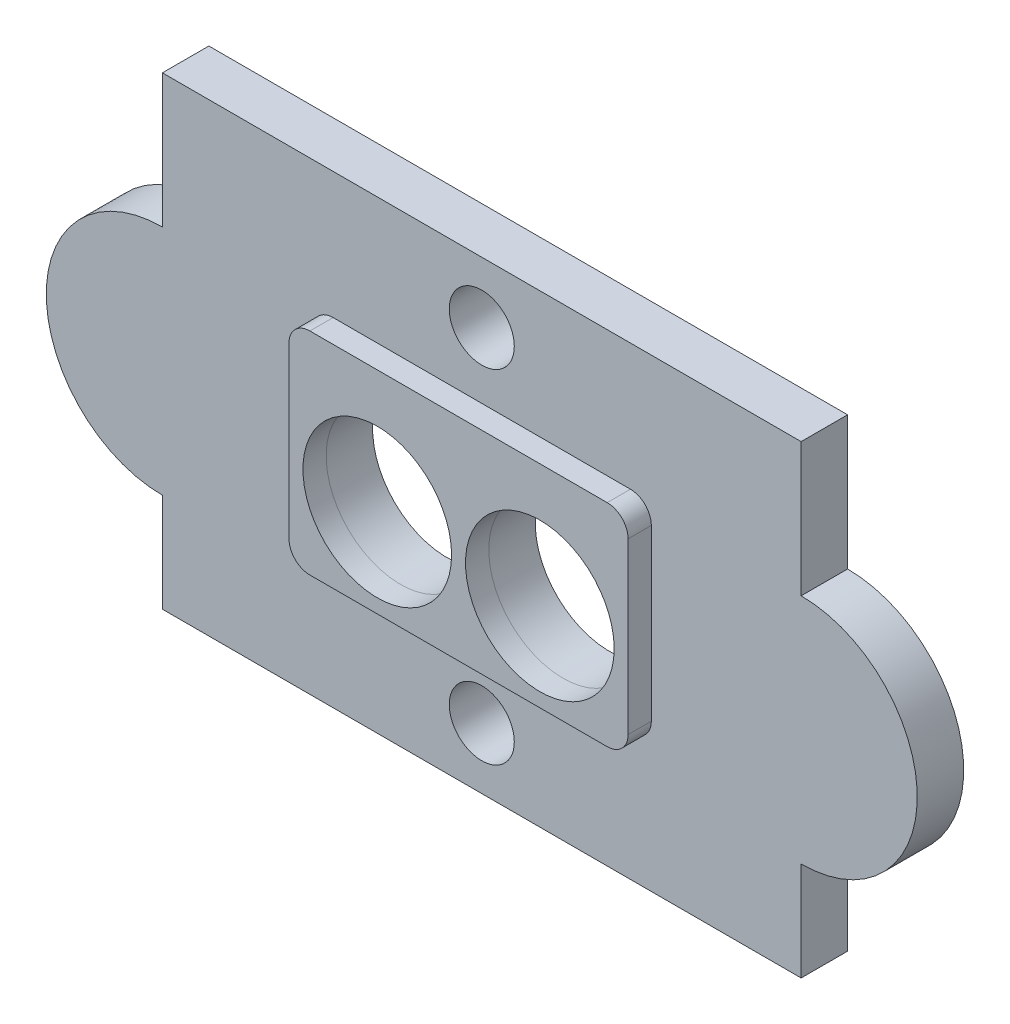
ISO-10303-21;
HEADER;
FILE_DESCRIPTION(('STEP AP214'),'2;1');
FILE_NAME('part.step','',(''),(''),'','','');
FILE_SCHEMA(('AUTOMOTIVE_DESIGN { 1 0 10303 214 1 1 1 1 }'));
ENDSEC;
DATA;
#1=APPLICATION_CONTEXT('core data for automotive mechanical design processes');
#2=APPLICATION_PROTOCOL_DEFINITION('international standard','automotive_design',2000,#1);
#3=PRODUCT_CONTEXT('',#1,'mechanical');
#4=PRODUCT('Part','Part','',(#3));
#5=PRODUCT_RELATED_PRODUCT_CATEGORY('part','',(#4));
#6=PRODUCT_DEFINITION_FORMATION('','',#4);
#7=PRODUCT_DEFINITION_CONTEXT('part definition',#1,'design');
#8=PRODUCT_DEFINITION('design','',#6,#7);
#9=PRODUCT_DEFINITION_SHAPE('','',#8);
#10=(LENGTH_UNIT() NAMED_UNIT(*) SI_UNIT(.MILLI.,.METRE.));
#11=(NAMED_UNIT(*) PLANE_ANGLE_UNIT() SI_UNIT($,.RADIAN.));
#12=(NAMED_UNIT(*) SI_UNIT($,.STERADIAN.) SOLID_ANGLE_UNIT());
#13=UNCERTAINTY_MEASURE_WITH_UNIT(LENGTH_MEASURE(1.E-05),#10,'distance_accuracy_value','');
#14=(GEOMETRIC_REPRESENTATION_CONTEXT(3) GLOBAL_UNCERTAINTY_ASSIGNED_CONTEXT((#13)) GLOBAL_UNIT_ASSIGNED_CONTEXT((#10,
#11,#12)) REPRESENTATION_CONTEXT('',''));
#15=CARTESIAN_POINT('',(0.,0.,0.));
#16=DIRECTION('',(0.,0.,1.));
#17=DIRECTION('',(1.,0.,0.));
#18=AXIS2_PLACEMENT_3D('',#15,#16,#17);
#19=CARTESIAN_POINT('',(0.,0.,-2.));
#20=DIRECTION('',(0.,0.,1.));
#21=DIRECTION('',(1.,0.,0.));
#22=AXIS2_PLACEMENT_3D('',#19,#20,#21);
#23=PLANE('',#22);
#24=DIRECTION('',(-1.,0.,0.));
#25=VECTOR('',#24,1.);
#26=CARTESIAN_POINT('',(0.,10.,-2.));
#27=LINE('',#26,#25);
#28=CARTESIAN_POINT('',(13.75,10.,-2.));
#29=VERTEX_POINT('',#28);
#30=CARTESIAN_POINT('',(-13.75,10.,-2.));
#31=VERTEX_POINT('',#30);
#32=EDGE_CURVE('E183',#29,#31,#27,.T.);
#33=ORIENTED_EDGE('',*,*,#32,.F.);
#34=DIRECTION('',(0.,1.,0.));
#35=VECTOR('',#34,1.);
#36=CARTESIAN_POINT('',(13.75,0.,-2.));
#37=LINE('',#36,#35);
#38=CARTESIAN_POINT('',(13.75,4.25,-2.));
#39=VERTEX_POINT('',#38);
#40=EDGE_CURVE('E128',#39,#29,#37,.T.);
#41=ORIENTED_EDGE('',*,*,#40,.F.);
#42=CARTESIAN_POINT('',(13.75,-0.749999999999997,-2.));
#43=DIRECTION('',(0.,0.,1.));
#44=DIRECTION('',(1.,0.,0.));
#45=AXIS2_PLACEMENT_3D('',#42,#43,#44);
#46=CIRCLE('',#45,5.);
#47=CARTESIAN_POINT('',(13.75,-5.75,-2.));
#48=VERTEX_POINT('',#47);
#49=EDGE_CURVE('E121',#39,#48,#46,.F.);
#50=ORIENTED_EDGE('',*,*,#49,.T.);
#51=DIRECTION('',(0.,1.,0.));
#52=VECTOR('',#51,1.);
#53=CARTESIAN_POINT('',(13.75,0.,-2.));
#54=LINE('',#53,#52);
#55=CARTESIAN_POINT('',(13.75,-10.,-2.));
#56=VERTEX_POINT('',#55);
#57=EDGE_CURVE('E126',#56,#48,#54,.T.);
#58=ORIENTED_EDGE('',*,*,#57,.F.);
#59=DIRECTION('',(1.,0.,0.));
#60=VECTOR('',#59,1.);
#61=CARTESIAN_POINT('',(0.,-10.,-2.));
#62=LINE('',#61,#60);
#63=CARTESIAN_POINT('',(-13.75,-10.,-2.));
#64=VERTEX_POINT('',#63);
#65=EDGE_CURVE('E139',#64,#56,#62,.T.);
#66=ORIENTED_EDGE('',*,*,#65,.F.);
#67=DIRECTION('',(0.,-1.,0.));
#68=VECTOR('',#67,1.);
#69=CARTESIAN_POINT('',(-13.75,0.,-2.));
#70=LINE('',#69,#68);
#71=CARTESIAN_POINT('',(-13.75,-5.75,-2.));
#72=VERTEX_POINT('',#71);
#73=EDGE_CURVE('E141',#72,#64,#70,.T.);
#74=ORIENTED_EDGE('',*,*,#73,.F.);
#75=CARTESIAN_POINT('',(-13.75,-0.749999999999997,-2.));
#76=DIRECTION('',(0.,0.,1.));
#77=DIRECTION('',(1.,0.,0.));
#78=AXIS2_PLACEMENT_3D('',#75,#76,#77);
#79=CIRCLE('',#78,5.);
#80=CARTESIAN_POINT('',(-13.75,4.25,-2.));
#81=VERTEX_POINT('',#80);
#82=EDGE_CURVE('E237',#81,#72,#79,.T.);
#83=ORIENTED_EDGE('',*,*,#82,.F.);
#84=DIRECTION('',(0.,-1.,0.));
#85=VECTOR('',#84,1.);
#86=CARTESIAN_POINT('',(-13.75,0.,-2.));
#87=LINE('',#86,#85);
#88=EDGE_CURVE('E235',#31,#81,#87,.T.);
#89=ORIENTED_EDGE('',*,*,#88,.F.);
#90=EDGE_LOOP('',(#33,#41,#50,#58,#66,#74,#83,#89));
#91=FACE_BOUND('',#90,.T.);
#92=CARTESIAN_POINT('',(3.5,-0.749999999999997,-2.));
#93=DIRECTION('',(0.,0.,1.));
#94=DIRECTION('',(1.,0.,0.));
#95=AXIS2_PLACEMENT_3D('',#92,#93,#94);
#96=CIRCLE('',#95,3.2);
#97=CARTESIAN_POINT('',(6.7,-0.749999999999997,-2.));
#98=VERTEX_POINT('',#97);
#99=EDGE_CURVE('E231',#98,#98,#96,.T.);
#100=ORIENTED_EDGE('',*,*,#99,.T.);
#101=EDGE_LOOP('',(#100));
#102=FACE_BOUND('',#101,.T.);
#103=CARTESIAN_POINT('',(-3.5,-0.749999999999997,-2.));
#104=DIRECTION('',(0.,0.,1.));
#105=DIRECTION('',(1.,0.,0.));
#106=AXIS2_PLACEMENT_3D('',#103,#104,#105);
#107=CIRCLE('',#106,3.2);
#108=CARTESIAN_POINT('',(-0.300000000000003,-0.749999999999997,-2.));
#109=VERTEX_POINT('',#108);
#110=EDGE_CURVE('E173',#109,#109,#107,.T.);
#111=ORIENTED_EDGE('',*,*,#110,.T.);
#112=EDGE_LOOP('',(#111));
#113=FACE_BOUND('',#112,.T.);
#114=CARTESIAN_POINT('',(0.,-7.375,-2.));
#115=DIRECTION('',(0.,0.,1.));
#116=DIRECTION('',(1.,0.,0.));
#117=AXIS2_PLACEMENT_3D('',#114,#115,#116);
#118=CIRCLE('',#117,1.4);
#119=CARTESIAN_POINT('',(1.4,-7.375,-2.));
#120=VERTEX_POINT('',#119);
#121=EDGE_CURVE('E220',#120,#120,#118,.F.);
#122=ORIENTED_EDGE('',*,*,#121,.F.);
#123=EDGE_LOOP('',(#122));
#124=FACE_BOUND('',#123,.T.);
#125=CARTESIAN_POINT('',(0.,7.375,-2.));
#126=DIRECTION('',(0.,0.,1.));
#127=DIRECTION('',(1.,0.,0.));
#128=AXIS2_PLACEMENT_3D('',#125,#126,#127);
#129=CIRCLE('',#128,1.4);
#130=CARTESIAN_POINT('',(1.4,7.375,-2.));
#131=VERTEX_POINT('',#130);
#132=EDGE_CURVE('E150',#131,#131,#129,.T.);
#133=ORIENTED_EDGE('',*,*,#132,.T.);
#134=EDGE_LOOP('',(#133));
#135=FACE_BOUND('',#134,.T.);
#136=ADVANCED_FACE('F48',(#91,#102,#113,#124,#135),#23,.F.);
#137=CARTESIAN_POINT('',(0.,0.,0.));
#138=DIRECTION('',(0.,0.,1.));
#139=DIRECTION('',(1.,0.,0.));
#140=AXIS2_PLACEMENT_3D('',#137,#138,#139);
#141=PLANE('',#140);
#142=CARTESIAN_POINT('',(0.,-7.375,0.));
#143=DIRECTION('',(0.,0.,1.));
#144=DIRECTION('',(1.,0.,0.));
#145=AXIS2_PLACEMENT_3D('',#142,#143,#144);
#146=CIRCLE('',#145,1.4);
#147=CARTESIAN_POINT('',(1.4,-7.375,0.));
#148=VERTEX_POINT('',#147);
#149=EDGE_CURVE('E224',#148,#148,#146,.F.);
#150=ORIENTED_EDGE('',*,*,#149,.T.);
#151=EDGE_LOOP('',(#150));
#152=FACE_BOUND('',#151,.T.);
#153=CARTESIAN_POINT('',(-3.5,-0.749999999999997,0.));
#154=DIRECTION('',(0.,0.,1.));
#155=DIRECTION('',(1.,0.,0.));
#156=AXIS2_PLACEMENT_3D('',#153,#154,#155);
#157=CIRCLE('',#156,3.2);
#158=CARTESIAN_POINT('',(-0.300000000000003,-0.749999999999997,0.));
#159=VERTEX_POINT('',#158);
#160=EDGE_CURVE('E146',#159,#159,#157,.T.);
#161=ORIENTED_EDGE('',*,*,#160,.F.);
#162=EDGE_LOOP('',(#161));
#163=FACE_BOUND('',#162,.T.);
#164=CARTESIAN_POINT('',(3.5,-0.749999999999997,0.));
#165=DIRECTION('',(0.,0.,1.));
#166=DIRECTION('',(1.,0.,0.));
#167=AXIS2_PLACEMENT_3D('',#164,#165,#166);
#168=CIRCLE('',#167,3.2);
#169=CARTESIAN_POINT('',(6.7,-0.749999999999997,0.));
#170=VERTEX_POINT('',#169);
#171=EDGE_CURVE('E149',#170,#170,#168,.T.);
#172=ORIENTED_EDGE('',*,*,#171,.F.);
#173=EDGE_LOOP('',(#172));
#174=FACE_BOUND('',#173,.T.);
#175=DIRECTION('',(-1.,0.,0.));
#176=VECTOR('',#175,1.);
#177=CARTESIAN_POINT('',(0.,10.,0.));
#178=LINE('',#177,#176);
#179=CARTESIAN_POINT('',(13.75,10.,0.));
#180=VERTEX_POINT('',#179);
#181=CARTESIAN_POINT('',(-13.75,10.,0.));
#182=VERTEX_POINT('',#181);
#183=EDGE_CURVE('E153',#180,#182,#178,.T.);
#184=ORIENTED_EDGE('',*,*,#183,.T.);
#185=DIRECTION('',(0.,-1.,0.));
#186=VECTOR('',#185,1.);
#187=CARTESIAN_POINT('',(-13.75,0.,0.));
#188=LINE('',#187,#186);
#189=CARTESIAN_POINT('',(-13.75,4.25,0.));
#190=VERTEX_POINT('',#189);
#191=EDGE_CURVE('E156',#182,#190,#188,.T.);
#192=ORIENTED_EDGE('',*,*,#191,.T.);
#193=CARTESIAN_POINT('',(-13.75,-0.749999999999997,0.));
#194=DIRECTION('',(0.,0.,1.));
#195=DIRECTION('',(1.,0.,0.));
#196=AXIS2_PLACEMENT_3D('',#193,#194,#195);
#197=CIRCLE('',#196,5.);
#198=CARTESIAN_POINT('',(-13.75,-5.75,0.));
#199=VERTEX_POINT('',#198);
#200=EDGE_CURVE('E159',#190,#199,#197,.T.);
#201=ORIENTED_EDGE('',*,*,#200,.T.);
#202=DIRECTION('',(0.,-1.,0.));
#203=VECTOR('',#202,1.);
#204=CARTESIAN_POINT('',(-13.75,0.,0.));
#205=LINE('',#204,#203);
#206=CARTESIAN_POINT('',(-13.75,-10.,0.));
#207=VERTEX_POINT('',#206);
#208=EDGE_CURVE('E162',#199,#207,#205,.T.);
#209=ORIENTED_EDGE('',*,*,#208,.T.);
#210=DIRECTION('',(1.,0.,0.));
#211=VECTOR('',#210,1.);
#212=CARTESIAN_POINT('',(0.,-10.,0.));
#213=LINE('',#212,#211);
#214=CARTESIAN_POINT('',(13.75,-10.,0.));
#215=VERTEX_POINT('',#214);
#216=EDGE_CURVE('E165',#207,#215,#213,.T.);
#217=ORIENTED_EDGE('',*,*,#216,.T.);
#218=DIRECTION('',(0.,1.,0.));
#219=VECTOR('',#218,1.);
#220=CARTESIAN_POINT('',(13.75,0.,0.));
#221=LINE('',#220,#219);
#222=CARTESIAN_POINT('',(13.75,-5.75,0.));
#223=VERTEX_POINT('',#222);
#224=EDGE_CURVE('E168',#215,#223,#221,.T.);
#225=ORIENTED_EDGE('',*,*,#224,.T.);
#226=CARTESIAN_POINT('',(13.75,-0.749999999999997,0.));
#227=DIRECTION('',(0.,0.,1.));
#228=DIRECTION('',(1.,0.,0.));
#229=AXIS2_PLACEMENT_3D('',#226,#227,#228);
#230=CIRCLE('',#229,5.);
#231=CARTESIAN_POINT('',(13.75,4.25,0.));
#232=VERTEX_POINT('',#231);
#233=EDGE_CURVE('E132',#232,#223,#230,.F.);
#234=ORIENTED_EDGE('',*,*,#233,.F.);
#235=DIRECTION('',(0.,1.,0.));
#236=VECTOR('',#235,1.);
#237=CARTESIAN_POINT('',(13.75,0.,0.));
#238=LINE('',#237,#236);
#239=EDGE_CURVE('E171',#232,#180,#238,.T.);
#240=ORIENTED_EDGE('',*,*,#239,.T.);
#241=EDGE_LOOP('',(#184,#192,#201,#209,#217,#225,#234,#240));
#242=FACE_BOUND('',#241,.T.);
#243=CARTESIAN_POINT('',(0.,7.375,0.));
#244=DIRECTION('',(0.,0.,1.));
#245=DIRECTION('',(1.,0.,0.));
#246=AXIS2_PLACEMENT_3D('',#243,#244,#245);
#247=CIRCLE('',#246,1.4);
#248=CARTESIAN_POINT('',(1.4,7.375,0.));
#249=VERTEX_POINT('',#248);
#250=EDGE_CURVE('E219',#249,#249,#247,.T.);
#251=ORIENTED_EDGE('',*,*,#250,.F.);
#252=EDGE_LOOP('',(#251));
#253=FACE_BOUND('',#252,.T.);
#254=ADVANCED_FACE('F186',(#152,#163,#174,#242,#253),#141,.T.);
#255=CARTESIAN_POINT('',(0.,10.,-2.));
#256=DIRECTION('',(0.,1.,0.));
#257=DIRECTION('',(0.,0.,1.));
#258=AXIS2_PLACEMENT_3D('',#255,#256,#257);
#259=PLANE('',#258);
#260=ORIENTED_EDGE('',*,*,#183,.F.);
#261=DIRECTION('',(0.,0.,1.));
#262=VECTOR('',#261,1.);
#263=CARTESIAN_POINT('',(13.75,10.,-2.));
#264=LINE('',#263,#262);
#265=EDGE_CURVE('E12',#29,#180,#264,.T.);
#266=ORIENTED_EDGE('',*,*,#265,.F.);
#267=ORIENTED_EDGE('',*,*,#32,.T.);
#268=DIRECTION('',(0.,0.,1.));
#269=VECTOR('',#268,1.);
#270=CARTESIAN_POINT('',(-13.75,10.,-2.));
#271=LINE('',#270,#269);
#272=EDGE_CURVE('E52',#31,#182,#271,.T.);
#273=ORIENTED_EDGE('',*,*,#272,.T.);
#274=EDGE_LOOP('',(#260,#266,#267,#273));
#275=FACE_BOUND('',#274,.T.);
#276=ADVANCED_FACE('F182',(#275),#259,.T.);
#277=CARTESIAN_POINT('',(13.75,0.,-2.));
#278=DIRECTION('',(1.,0.,0.));
#279=DIRECTION('',(0.,1.,0.));
#280=AXIS2_PLACEMENT_3D('',#277,#278,#279);
#281=PLANE('',#280);
#282=ORIENTED_EDGE('',*,*,#239,.F.);
#283=DIRECTION('',(0.,0.,1.));
#284=VECTOR('',#283,1.);
#285=CARTESIAN_POINT('',(13.75,4.25,-2.));
#286=LINE('',#285,#284);
#287=EDGE_CURVE('E58',#39,#232,#286,.T.);
#288=ORIENTED_EDGE('',*,*,#287,.F.);
#289=ORIENTED_EDGE('',*,*,#40,.T.);
#290=ORIENTED_EDGE('',*,*,#265,.T.);
#291=EDGE_LOOP('',(#282,#288,#289,#290));
#292=FACE_BOUND('',#291,.T.);
#293=ADVANCED_FACE('F188',(#292),#281,.T.);
#294=CARTESIAN_POINT('',(13.75,-0.749999999999997,-2.));
#295=DIRECTION('',(0.,0.,1.));
#296=DIRECTION('',(1.,0.,0.));
#297=AXIS2_PLACEMENT_3D('',#294,#295,#296);
#298=CYLINDRICAL_SURFACE('',#297,5.);
#299=ORIENTED_EDGE('',*,*,#233,.T.);
#300=DIRECTION('',(0.,0.,1.));
#301=VECTOR('',#300,1.);
#302=CARTESIAN_POINT('',(13.75,-5.75,-2.));
#303=LINE('',#302,#301);
#304=EDGE_CURVE('E130',#48,#223,#303,.T.);
#305=ORIENTED_EDGE('',*,*,#304,.F.);
#306=ORIENTED_EDGE('',*,*,#49,.F.);
#307=ORIENTED_EDGE('',*,*,#287,.T.);
#308=EDGE_LOOP('',(#299,#305,#306,#307));
#309=FACE_BOUND('',#308,.T.);
#310=ADVANCED_FACE('F131',(#309),#298,.T.);
#311=CARTESIAN_POINT('',(13.75,0.,-2.));
#312=DIRECTION('',(1.,0.,0.));
#313=DIRECTION('',(0.,1.,0.));
#314=AXIS2_PLACEMENT_3D('',#311,#312,#313);
#315=PLANE('',#314);
#316=ORIENTED_EDGE('',*,*,#224,.F.);
#317=DIRECTION('',(0.,0.,1.));
#318=VECTOR('',#317,1.);
#319=CARTESIAN_POINT('',(13.75,-10.,-2.));
#320=LINE('',#319,#318);
#321=EDGE_CURVE('E136',#56,#215,#320,.T.);
#322=ORIENTED_EDGE('',*,*,#321,.F.);
#323=ORIENTED_EDGE('',*,*,#57,.T.);
#324=ORIENTED_EDGE('',*,*,#304,.T.);
#325=EDGE_LOOP('',(#316,#322,#323,#324));
#326=FACE_BOUND('',#325,.T.);
#327=ADVANCED_FACE('F138',(#326),#315,.T.);
#328=CARTESIAN_POINT('',(0.,-10.,-2.));
#329=DIRECTION('',(0.,-1.,0.));
#330=DIRECTION('',(0.,0.,-1.));
#331=AXIS2_PLACEMENT_3D('',#328,#329,#330);
#332=PLANE('',#331);
#333=ORIENTED_EDGE('',*,*,#216,.F.);
#334=DIRECTION('',(0.,0.,1.));
#335=VECTOR('',#334,1.);
#336=CARTESIAN_POINT('',(-13.75,-10.,-2.));
#337=LINE('',#336,#335);
#338=EDGE_CURVE('E177',#64,#207,#337,.T.);
#339=ORIENTED_EDGE('',*,*,#338,.F.);
#340=ORIENTED_EDGE('',*,*,#65,.T.);
#341=ORIENTED_EDGE('',*,*,#321,.T.);
#342=EDGE_LOOP('',(#333,#339,#340,#341));
#343=FACE_BOUND('',#342,.T.);
#344=ADVANCED_FACE('F249',(#343),#332,.T.);
#345=CARTESIAN_POINT('',(-13.75,0.,-2.));
#346=DIRECTION('',(-1.,0.,0.));
#347=DIRECTION('',(0.,-1.,0.));
#348=AXIS2_PLACEMENT_3D('',#345,#346,#347);
#349=PLANE('',#348);
#350=ORIENTED_EDGE('',*,*,#208,.F.);
#351=DIRECTION('',(0.,0.,1.));
#352=VECTOR('',#351,1.);
#353=CARTESIAN_POINT('',(-13.75,-5.75,-2.));
#354=LINE('',#353,#352);
#355=EDGE_CURVE('E179',#72,#199,#354,.T.);
#356=ORIENTED_EDGE('',*,*,#355,.F.);
#357=ORIENTED_EDGE('',*,*,#73,.T.);
#358=ORIENTED_EDGE('',*,*,#338,.T.);
#359=EDGE_LOOP('',(#350,#356,#357,#358));
#360=FACE_BOUND('',#359,.T.);
#361=ADVANCED_FACE('F243',(#360),#349,.T.);
#362=CARTESIAN_POINT('',(-13.75,-0.749999999999997,-2.));
#363=DIRECTION('',(0.,0.,1.));
#364=DIRECTION('',(1.,0.,0.));
#365=AXIS2_PLACEMENT_3D('',#362,#363,#364);
#366=CYLINDRICAL_SURFACE('',#365,5.);
#367=ORIENTED_EDGE('',*,*,#200,.F.);
#368=DIRECTION('',(0.,0.,1.));
#369=VECTOR('',#368,1.);
#370=CARTESIAN_POINT('',(-13.75,4.25,-2.));
#371=LINE('',#370,#369);
#372=EDGE_CURVE('E180',#81,#190,#371,.T.);
#373=ORIENTED_EDGE('',*,*,#372,.F.);
#374=ORIENTED_EDGE('',*,*,#82,.T.);
#375=ORIENTED_EDGE('',*,*,#355,.T.);
#376=EDGE_LOOP('',(#367,#373,#374,#375));
#377=FACE_BOUND('',#376,.T.);
#378=ADVANCED_FACE('F247',(#377),#366,.T.);
#379=CARTESIAN_POINT('',(3.5,-0.749999999999997,-2.));
#380=DIRECTION('',(0.,0.,1.));
#381=DIRECTION('',(1.,0.,0.));
#382=AXIS2_PLACEMENT_3D('',#379,#380,#381);
#383=CYLINDRICAL_SURFACE('',#382,3.2);
#384=ORIENTED_EDGE('',*,*,#99,.F.);
#385=EDGE_LOOP('',(#384));
#386=FACE_BOUND('',#385,.T.);
#387=ORIENTED_EDGE('',*,*,#171,.T.);
#388=EDGE_LOOP('',(#387));
#389=FACE_BOUND('',#388,.T.);
#390=ADVANCED_FACE('F261',(#386,#389),#383,.F.);
#391=CARTESIAN_POINT('',(-3.5,-0.749999999999997,-2.));
#392=DIRECTION('',(0.,0.,1.));
#393=DIRECTION('',(1.,0.,0.));
#394=AXIS2_PLACEMENT_3D('',#391,#392,#393);
#395=CYLINDRICAL_SURFACE('',#394,3.2);
#396=ORIENTED_EDGE('',*,*,#110,.F.);
#397=EDGE_LOOP('',(#396));
#398=FACE_BOUND('',#397,.T.);
#399=ORIENTED_EDGE('',*,*,#160,.T.);
#400=EDGE_LOOP('',(#399));
#401=FACE_BOUND('',#400,.T.);
#402=ADVANCED_FACE('F50',(#398,#401),#395,.F.);
#403=CARTESIAN_POINT('',(-13.75,0.,-2.));
#404=DIRECTION('',(-1.,0.,0.));
#405=DIRECTION('',(0.,-1.,0.));
#406=AXIS2_PLACEMENT_3D('',#403,#404,#405);
#407=PLANE('',#406);
#408=ORIENTED_EDGE('',*,*,#191,.F.);
#409=ORIENTED_EDGE('',*,*,#272,.F.);
#410=ORIENTED_EDGE('',*,*,#88,.T.);
#411=ORIENTED_EDGE('',*,*,#372,.T.);
#412=EDGE_LOOP('',(#408,#409,#410,#411));
#413=FACE_BOUND('',#412,.T.);
#414=ADVANCED_FACE('F184',(#413),#407,.T.);
#415=CARTESIAN_POINT('',(0.,-7.375,-2.));
#416=DIRECTION('',(0.,0.,1.));
#417=DIRECTION('',(1.,0.,0.));
#418=AXIS2_PLACEMENT_3D('',#415,#416,#417);
#419=CYLINDRICAL_SURFACE('',#418,1.4);
#420=ORIENTED_EDGE('',*,*,#121,.T.);
#421=EDGE_LOOP('',(#420));
#422=FACE_BOUND('',#421,.T.);
#423=ORIENTED_EDGE('',*,*,#149,.F.);
#424=EDGE_LOOP('',(#423));
#425=FACE_BOUND('',#424,.T.);
#426=ADVANCED_FACE('F205',(#422,#425),#419,.F.);
#427=CARTESIAN_POINT('',(0.,7.375,-2.));
#428=DIRECTION('',(0.,0.,1.));
#429=DIRECTION('',(1.,0.,0.));
#430=AXIS2_PLACEMENT_3D('',#427,#428,#429);
#431=CYLINDRICAL_SURFACE('',#430,1.4);
#432=ORIENTED_EDGE('',*,*,#132,.F.);
#433=EDGE_LOOP('',(#432));
#434=FACE_BOUND('',#433,.T.);
#435=ORIENTED_EDGE('',*,*,#250,.T.);
#436=EDGE_LOOP('',(#435));
#437=FACE_BOUND('',#436,.T.);
#438=ADVANCED_FACE('F208',(#434,#437),#431,.F.);
#439=CLOSED_SHELL('',(#136,#254,#276,#293,#310,#327,#344,#361,#378,#390,#402,#414,#426,#438));
#440=MANIFOLD_SOLID_BREP('B2',#439);
#441=CARTESIAN_POINT('',(0.,-4.55,1.));
#442=DIRECTION('',(0.,1.,0.));
#443=DIRECTION('',(0.,0.,1.));
#444=AXIS2_PLACEMENT_3D('',#441,#442,#443);
#445=PLANE('',#444);
#446=DIRECTION('',(1.,0.,0.));
#447=VECTOR('',#446,1.);
#448=CARTESIAN_POINT('',(0.,-4.55,1.));
#449=LINE('',#448,#447);
#450=CARTESIAN_POINT('',(-6.40000000000001,-4.55,1.));
#451=VERTEX_POINT('',#450);
#452=CARTESIAN_POINT('',(6.39999999999999,-4.55,1.));
#453=VERTEX_POINT('',#452);
#454=EDGE_CURVE('E548',#451,#453,#449,.T.);
#455=ORIENTED_EDGE('',*,*,#454,.F.);
#456=DIRECTION('',(0.,0.,-1.));
#457=VECTOR('',#456,1.);
#458=CARTESIAN_POINT('',(-6.40000000000001,-4.55,0.));
#459=LINE('',#458,#457);
#460=CARTESIAN_POINT('',(-6.40000000000001,-4.55,0.));
#461=VERTEX_POINT('',#460);
#462=EDGE_CURVE('E46',#451,#461,#459,.T.);
#463=ORIENTED_EDGE('',*,*,#462,.T.);
#464=DIRECTION('',(1.,0.,0.));
#465=VECTOR('',#464,1.);
#466=CARTESIAN_POINT('',(0.,-4.55,0.));
#467=LINE('',#466,#465);
#468=CARTESIAN_POINT('',(6.39999999999999,-4.55,0.));
#469=VERTEX_POINT('',#468);
#470=EDGE_CURVE('E498',#461,#469,#467,.T.);
#471=ORIENTED_EDGE('',*,*,#470,.T.);
#472=DIRECTION('',(0.,0.,-1.));
#473=VECTOR('',#472,1.);
#474=CARTESIAN_POINT('',(6.39999999999999,-4.55,1.));
#475=LINE('',#474,#473);
#476=EDGE_CURVE('E433',#469,#453,#475,.F.);
#477=ORIENTED_EDGE('',*,*,#476,.T.);
#478=EDGE_LOOP('',(#455,#463,#471,#477));
#479=FACE_BOUND('',#478,.T.);
#480=ADVANCED_FACE('F425',(#479),#445,.F.);
#481=CARTESIAN_POINT('',(7.29999999999999,0.,1.));
#482=DIRECTION('',(-1.,0.,0.));
#483=DIRECTION('',(0.,-1.,0.));
#484=AXIS2_PLACEMENT_3D('',#481,#482,#483);
#485=PLANE('',#484);
#486=DIRECTION('',(0.,1.,0.));
#487=VECTOR('',#486,1.);
#488=CARTESIAN_POINT('',(7.29999999999999,0.,0.));
#489=LINE('',#488,#487);
#490=CARTESIAN_POINT('',(7.29999999999999,-3.65,0.));
#491=VERTEX_POINT('',#490);
#492=CARTESIAN_POINT('',(7.29999999999999,3.65,0.));
#493=VERTEX_POINT('',#492);
#494=EDGE_CURVE('E559',#491,#493,#489,.T.);
#495=ORIENTED_EDGE('',*,*,#494,.T.);
#496=DIRECTION('',(0.,0.,-1.));
#497=VECTOR('',#496,1.);
#498=CARTESIAN_POINT('',(7.29999999999999,3.65,1.));
#499=LINE('',#498,#497);
#500=CARTESIAN_POINT('',(7.29999999999999,3.65,1.));
#501=VERTEX_POINT('',#500);
#502=EDGE_CURVE('E440',#493,#501,#499,.F.);
#503=ORIENTED_EDGE('',*,*,#502,.T.);
#504=DIRECTION('',(0.,1.,0.));
#505=VECTOR('',#504,1.);
#506=CARTESIAN_POINT('',(7.29999999999999,0.,1.));
#507=LINE('',#506,#505);
#508=CARTESIAN_POINT('',(7.29999999999999,-3.65,1.));
#509=VERTEX_POINT('',#508);
#510=EDGE_CURVE('E553',#509,#501,#507,.T.);
#511=ORIENTED_EDGE('',*,*,#510,.F.);
#512=DIRECTION('',(0.,0.,-1.));
#513=VECTOR('',#512,1.);
#514=CARTESIAN_POINT('',(7.29999999999999,-3.65,1.));
#515=LINE('',#514,#513);
#516=EDGE_CURVE('E542',#509,#491,#515,.T.);
#517=ORIENTED_EDGE('',*,*,#516,.T.);
#518=EDGE_LOOP('',(#495,#503,#511,#517));
#519=FACE_BOUND('',#518,.T.);
#520=ADVANCED_FACE('F558',(#519),#485,.F.);
#521=CARTESIAN_POINT('',(0.,4.55,1.));
#522=DIRECTION('',(0.,1.,0.));
#523=DIRECTION('',(-1.,0.,0.));
#524=AXIS2_PLACEMENT_3D('',#521,#522,#523);
#525=PLANE('',#524);
#526=DIRECTION('',(1.,0.,0.));
#527=VECTOR('',#526,1.);
#528=CARTESIAN_POINT('',(0.,4.55,0.));
#529=LINE('',#528,#527);
#530=CARTESIAN_POINT('',(-6.40000000000001,4.55,0.));
#531=VERTEX_POINT('',#530);
#532=CARTESIAN_POINT('',(6.39999999999999,4.55,0.));
#533=VERTEX_POINT('',#532);
#534=EDGE_CURVE('E514',#531,#533,#529,.T.);
#535=ORIENTED_EDGE('',*,*,#534,.F.);
#536=DIRECTION('',(0.,0.,-1.));
#537=VECTOR('',#536,1.);
#538=CARTESIAN_POINT('',(-6.40000000000001,4.55,1.));
#539=LINE('',#538,#537);
#540=CARTESIAN_POINT('',(-6.40000000000001,4.55,1.));
#541=VERTEX_POINT('',#540);
#542=EDGE_CURVE('E534',#531,#541,#539,.F.);
#543=ORIENTED_EDGE('',*,*,#542,.T.);
#544=DIRECTION('',(1.,0.,0.));
#545=VECTOR('',#544,1.);
#546=CARTESIAN_POINT('',(0.,4.55,1.));
#547=LINE('',#546,#545);
#548=CARTESIAN_POINT('',(6.39999999999999,4.55,1.));
#549=VERTEX_POINT('',#548);
#550=EDGE_CURVE('E569',#541,#549,#547,.T.);
#551=ORIENTED_EDGE('',*,*,#550,.T.);
#552=DIRECTION('',(0.,0.,-1.));
#553=VECTOR('',#552,1.);
#554=CARTESIAN_POINT('',(6.39999999999999,4.55,0.));
#555=LINE('',#554,#553);
#556=EDGE_CURVE('E531',#549,#533,#555,.T.);
#557=ORIENTED_EDGE('',*,*,#556,.T.);
#558=EDGE_LOOP('',(#535,#543,#551,#557));
#559=FACE_BOUND('',#558,.T.);
#560=ADVANCED_FACE('F598',(#559),#525,.T.);
#561=CARTESIAN_POINT('',(-7.30000000000001,0.,1.));
#562=DIRECTION('',(-1.,0.,0.));
#563=DIRECTION('',(0.,0.,1.));
#564=AXIS2_PLACEMENT_3D('',#561,#562,#563);
#565=PLANE('',#564);
#566=DIRECTION('',(0.,1.,0.));
#567=VECTOR('',#566,1.);
#568=CARTESIAN_POINT('',(-7.30000000000001,0.,1.));
#569=LINE('',#568,#567);
#570=CARTESIAN_POINT('',(-7.30000000000001,-3.65,1.));
#571=VERTEX_POINT('',#570);
#572=CARTESIAN_POINT('',(-7.30000000000001,3.65,1.));
#573=VERTEX_POINT('',#572);
#574=EDGE_CURVE('E523',#571,#573,#569,.T.);
#575=ORIENTED_EDGE('',*,*,#574,.T.);
#576=DIRECTION('',(0.,0.,-1.));
#577=VECTOR('',#576,1.);
#578=CARTESIAN_POINT('',(-7.30000000000001,3.65,1.));
#579=LINE('',#578,#577);
#580=CARTESIAN_POINT('',(-7.30000000000001,3.65,0.));
#581=VERTEX_POINT('',#580);
#582=EDGE_CURVE('E512',#573,#581,#579,.T.);
#583=ORIENTED_EDGE('',*,*,#582,.T.);
#584=DIRECTION('',(0.,1.,0.));
#585=VECTOR('',#584,1.);
#586=CARTESIAN_POINT('',(-7.30000000000001,0.,0.));
#587=LINE('',#586,#585);
#588=CARTESIAN_POINT('',(-7.30000000000001,-3.65,0.));
#589=VERTEX_POINT('',#588);
#590=EDGE_CURVE('E496',#589,#581,#587,.T.);
#591=ORIENTED_EDGE('',*,*,#590,.F.);
#592=DIRECTION('',(0.,0.,-1.));
#593=VECTOR('',#592,1.);
#594=CARTESIAN_POINT('',(-7.30000000000001,-3.65,1.));
#595=LINE('',#594,#593);
#596=EDGE_CURVE('E509',#589,#571,#595,.F.);
#597=ORIENTED_EDGE('',*,*,#596,.T.);
#598=EDGE_LOOP('',(#575,#583,#591,#597));
#599=FACE_BOUND('',#598,.T.);
#600=ADVANCED_FACE('F508',(#599),#565,.T.);
#601=CARTESIAN_POINT('',(3.5,-0.749999999999997,1.));
#602=DIRECTION('',(0.,0.,-1.));
#603=DIRECTION('',(-1.,0.,0.));
#604=AXIS2_PLACEMENT_3D('',#601,#602,#603);
#605=CYLINDRICAL_SURFACE('',#604,3.2);
#606=CARTESIAN_POINT('',(3.5,-0.749999999999997,1.));
#607=DIRECTION('',(0.,0.,1.));
#608=DIRECTION('',(1.,0.,0.));
#609=AXIS2_PLACEMENT_3D('',#606,#607,#608);
#610=CIRCLE('',#609,3.2);
#611=CARTESIAN_POINT('',(6.7,-0.749999999999997,1.));
#612=VERTEX_POINT('',#611);
#613=EDGE_CURVE('E554',#612,#612,#610,.F.);
#614=ORIENTED_EDGE('',*,*,#613,.F.);
#615=EDGE_LOOP('',(#614));
#616=FACE_BOUND('',#615,.T.);
#617=CARTESIAN_POINT('',(3.5,-0.749999999999997,0.));
#618=DIRECTION('',(0.,0.,1.));
#619=DIRECTION('',(1.,0.,0.));
#620=AXIS2_PLACEMENT_3D('',#617,#618,#619);
#621=CIRCLE('',#620,3.2);
#622=CARTESIAN_POINT('',(6.7,-0.749999999999997,0.));
#623=VERTEX_POINT('',#622);
#624=EDGE_CURVE('E563',#623,#623,#621,.F.);
#625=ORIENTED_EDGE('',*,*,#624,.T.);
#626=EDGE_LOOP('',(#625));
#627=FACE_BOUND('',#626,.T.);
#628=ADVANCED_FACE('F581',(#616,#627),#605,.F.);
#629=CARTESIAN_POINT('',(-3.5,-0.749999999999997,1.));
#630=DIRECTION('',(0.,0.,-1.));
#631=DIRECTION('',(-1.,0.,0.));
#632=AXIS2_PLACEMENT_3D('',#629,#630,#631);
#633=CYLINDRICAL_SURFACE('',#632,3.2);
#634=CARTESIAN_POINT('',(-3.5,-0.749999999999997,1.));
#635=DIRECTION('',(0.,0.,1.));
#636=DIRECTION('',(1.,0.,0.));
#637=AXIS2_PLACEMENT_3D('',#634,#635,#636);
#638=CIRCLE('',#637,3.2);
#639=CARTESIAN_POINT('',(-0.300000000000003,-0.749999999999997,1.));
#640=VERTEX_POINT('',#639);
#641=EDGE_CURVE('E519',#640,#640,#638,.T.);
#642=ORIENTED_EDGE('',*,*,#641,.T.);
#643=EDGE_LOOP('',(#642));
#644=FACE_BOUND('',#643,.T.);
#645=CARTESIAN_POINT('',(-3.5,-0.749999999999997,0.));
#646=DIRECTION('',(0.,0.,1.));
#647=DIRECTION('',(1.,0.,0.));
#648=AXIS2_PLACEMENT_3D('',#645,#646,#647);
#649=CIRCLE('',#648,3.2);
#650=CARTESIAN_POINT('',(-0.300000000000003,-0.749999999999997,0.));
#651=VERTEX_POINT('',#650);
#652=EDGE_CURVE('E513',#651,#651,#649,.T.);
#653=ORIENTED_EDGE('',*,*,#652,.F.);
#654=EDGE_LOOP('',(#653));
#655=FACE_BOUND('',#654,.T.);
#656=ADVANCED_FACE('F579',(#644,#655),#633,.F.);
#657=CARTESIAN_POINT('',(0.,0.,1.));
#658=DIRECTION('',(0.,0.,1.));
#659=DIRECTION('',(1.,0.,0.));
#660=AXIS2_PLACEMENT_3D('',#657,#658,#659);
#661=PLANE('',#660);
#662=ORIENTED_EDGE('',*,*,#613,.T.);
#663=EDGE_LOOP('',(#662));
#664=FACE_BOUND('',#663,.T.);
#665=ORIENTED_EDGE('',*,*,#550,.F.);
#666=CARTESIAN_POINT('',(-6.40000000000001,3.65,1.));
#667=DIRECTION('',(0.,0.,1.));
#668=DIRECTION('',(1.,0.,0.));
#669=AXIS2_PLACEMENT_3D('',#666,#667,#668);
#670=CIRCLE('',#669,0.9);
#671=EDGE_CURVE('E540',#541,#573,#670,.T.);
#672=ORIENTED_EDGE('',*,*,#671,.T.);
#673=ORIENTED_EDGE('',*,*,#574,.F.);
#674=CARTESIAN_POINT('',(-6.40000000000001,-3.65,1.));
#675=DIRECTION('',(0.,0.,1.));
#676=DIRECTION('',(1.,0.,0.));
#677=AXIS2_PLACEMENT_3D('',#674,#675,#676);
#678=CIRCLE('',#677,0.9);
#679=EDGE_CURVE('E518',#571,#451,#678,.T.);
#680=ORIENTED_EDGE('',*,*,#679,.T.);
#681=ORIENTED_EDGE('',*,*,#454,.T.);
#682=CARTESIAN_POINT('',(6.39999999999999,-3.65,1.));
#683=DIRECTION('',(0.,0.,1.));
#684=DIRECTION('',(1.,0.,0.));
#685=AXIS2_PLACEMENT_3D('',#682,#683,#684);
#686=CIRCLE('',#685,0.9);
#687=EDGE_CURVE('E447',#453,#509,#686,.T.);
#688=ORIENTED_EDGE('',*,*,#687,.T.);
#689=ORIENTED_EDGE('',*,*,#510,.T.);
#690=CARTESIAN_POINT('',(6.39999999999999,3.65,1.));
#691=DIRECTION('',(0.,0.,1.));
#692=DIRECTION('',(1.,0.,0.));
#693=AXIS2_PLACEMENT_3D('',#690,#691,#692);
#694=CIRCLE('',#693,0.9);
#695=EDGE_CURVE('E538',#501,#549,#694,.T.);
#696=ORIENTED_EDGE('',*,*,#695,.T.);
#697=EDGE_LOOP('',(#665,#672,#673,#680,#681,#688,#689,#696));
#698=FACE_BOUND('',#697,.T.);
#699=ORIENTED_EDGE('',*,*,#641,.F.);
#700=EDGE_LOOP('',(#699));
#701=FACE_BOUND('',#700,.T.);
#702=ADVANCED_FACE('F551',(#664,#698,#701),#661,.T.);
#703=CARTESIAN_POINT('',(0.,0.,0.));
#704=DIRECTION('',(0.,0.,1.));
#705=DIRECTION('',(1.,0.,0.));
#706=AXIS2_PLACEMENT_3D('',#703,#704,#705);
#707=PLANE('',#706);
#708=ORIENTED_EDGE('',*,*,#624,.F.);
#709=EDGE_LOOP('',(#708));
#710=FACE_BOUND('',#709,.T.);
#711=ORIENTED_EDGE('',*,*,#590,.T.);
#712=CARTESIAN_POINT('',(-6.40000000000001,3.65,0.));
#713=DIRECTION('',(0.,0.,1.));
#714=DIRECTION('',(1.,0.,0.));
#715=AXIS2_PLACEMENT_3D('',#712,#713,#714);
#716=CIRCLE('',#715,0.9);
#717=EDGE_CURVE('E529',#581,#531,#716,.F.);
#718=ORIENTED_EDGE('',*,*,#717,.T.);
#719=ORIENTED_EDGE('',*,*,#534,.T.);
#720=CARTESIAN_POINT('',(6.39999999999999,3.65,0.));
#721=DIRECTION('',(0.,0.,1.));
#722=DIRECTION('',(1.,0.,0.));
#723=AXIS2_PLACEMENT_3D('',#720,#721,#722);
#724=CIRCLE('',#723,0.9);
#725=EDGE_CURVE('E502',#533,#493,#724,.F.);
#726=ORIENTED_EDGE('',*,*,#725,.T.);
#727=ORIENTED_EDGE('',*,*,#494,.F.);
#728=CARTESIAN_POINT('',(6.39999999999999,-3.65,0.));
#729=DIRECTION('',(0.,0.,1.));
#730=DIRECTION('',(1.,0.,0.));
#731=AXIS2_PLACEMENT_3D('',#728,#729,#730);
#732=CIRCLE('',#731,0.9);
#733=EDGE_CURVE('E503',#491,#469,#732,.F.);
#734=ORIENTED_EDGE('',*,*,#733,.T.);
#735=ORIENTED_EDGE('',*,*,#470,.F.);
#736=CARTESIAN_POINT('',(-6.40000000000001,-3.65,0.));
#737=DIRECTION('',(0.,0.,1.));
#738=DIRECTION('',(1.,0.,0.));
#739=AXIS2_PLACEMENT_3D('',#736,#737,#738);
#740=CIRCLE('',#739,0.9);
#741=EDGE_CURVE('E492',#461,#589,#740,.F.);
#742=ORIENTED_EDGE('',*,*,#741,.T.);
#743=EDGE_LOOP('',(#711,#718,#719,#726,#727,#734,#735,#742));
#744=FACE_BOUND('',#743,.T.);
#745=ORIENTED_EDGE('',*,*,#652,.T.);
#746=EDGE_LOOP('',(#745));
#747=FACE_BOUND('',#746,.T.);
#748=ADVANCED_FACE('F494',(#710,#744,#747),#707,.F.);
#749=CARTESIAN_POINT('',(-6.40000000000001,3.65,1.));
#750=DIRECTION('',(0.,0.,-1.));
#751=DIRECTION('',(-1.,0.,0.));
#752=AXIS2_PLACEMENT_3D('',#749,#750,#751);
#753=CYLINDRICAL_SURFACE('',#752,0.9);
#754=ORIENTED_EDGE('',*,*,#671,.F.);
#755=ORIENTED_EDGE('',*,*,#542,.F.);
#756=ORIENTED_EDGE('',*,*,#717,.F.);
#757=ORIENTED_EDGE('',*,*,#582,.F.);
#758=EDGE_LOOP('',(#754,#755,#756,#757));
#759=FACE_BOUND('',#758,.T.);
#760=ADVANCED_FACE('F602',(#759),#753,.T.);
#761=CARTESIAN_POINT('',(6.39999999999999,3.65,1.));
#762=DIRECTION('',(0.,0.,1.));
#763=DIRECTION('',(1.,0.,0.));
#764=AXIS2_PLACEMENT_3D('',#761,#762,#763);
#765=CYLINDRICAL_SURFACE('',#764,0.9);
#766=ORIENTED_EDGE('',*,*,#695,.F.);
#767=ORIENTED_EDGE('',*,*,#502,.F.);
#768=ORIENTED_EDGE('',*,*,#725,.F.);
#769=ORIENTED_EDGE('',*,*,#556,.F.);
#770=EDGE_LOOP('',(#766,#767,#768,#769));
#771=FACE_BOUND('',#770,.T.);
#772=ADVANCED_FACE('F605',(#771),#765,.T.);
#773=CARTESIAN_POINT('',(-6.40000000000001,-3.65,1.));
#774=DIRECTION('',(0.,0.,1.));
#775=DIRECTION('',(1.,0.,0.));
#776=AXIS2_PLACEMENT_3D('',#773,#774,#775);
#777=CYLINDRICAL_SURFACE('',#776,0.9);
#778=ORIENTED_EDGE('',*,*,#679,.F.);
#779=ORIENTED_EDGE('',*,*,#596,.F.);
#780=ORIENTED_EDGE('',*,*,#741,.F.);
#781=ORIENTED_EDGE('',*,*,#462,.F.);
#782=EDGE_LOOP('',(#778,#779,#780,#781));
#783=FACE_BOUND('',#782,.T.);
#784=ADVANCED_FACE('F517',(#783),#777,.T.);
#785=CARTESIAN_POINT('',(6.39999999999999,-3.65,1.));
#786=DIRECTION('',(0.,0.,-1.));
#787=DIRECTION('',(-1.,0.,0.));
#788=AXIS2_PLACEMENT_3D('',#785,#786,#787);
#789=CYLINDRICAL_SURFACE('',#788,0.9);
#790=ORIENTED_EDGE('',*,*,#687,.F.);
#791=ORIENTED_EDGE('',*,*,#476,.F.);
#792=ORIENTED_EDGE('',*,*,#733,.F.);
#793=ORIENTED_EDGE('',*,*,#516,.F.);
#794=EDGE_LOOP('',(#790,#791,#792,#793));
#795=FACE_BOUND('',#794,.T.);
#796=ADVANCED_FACE('F427',(#795),#789,.T.);
#797=CLOSED_SHELL('',(#480,#520,#560,#600,#628,#656,#702,#748,#760,#772,#784,#796));
#798=MANIFOLD_SOLID_BREP('B6',#797);
#799=ADVANCED_BREP_SHAPE_REPRESENTATION('',(#18,#440,#798),#14);
#800=SHAPE_DEFINITION_REPRESENTATION(#9,#799);
ENDSEC;
END-ISO-10303-21;
